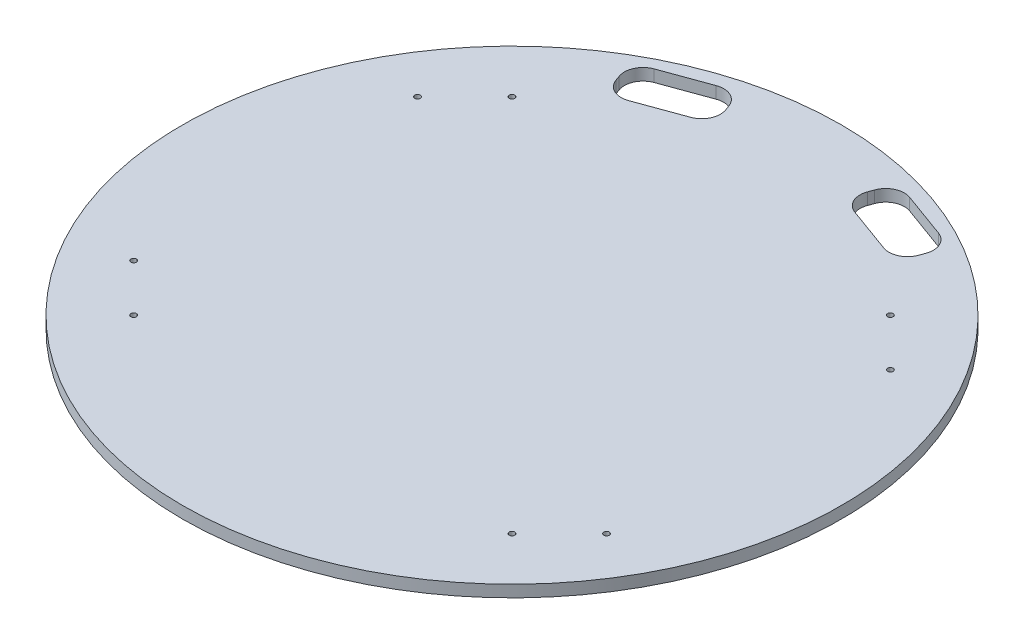
ISO-10303-21;
HEADER;
FILE_DESCRIPTION(('STEP AP214'),'2;1');
FILE_NAME('part.step','',(''),(''),'','','');
FILE_SCHEMA(('AUTOMOTIVE_DESIGN { 1 0 10303 214 1 1 1 1 }'));
ENDSEC;
DATA;
#1=APPLICATION_CONTEXT('core data for automotive mechanical design processes');
#2=APPLICATION_PROTOCOL_DEFINITION('international standard','automotive_design',2000,#1);
#3=PRODUCT_CONTEXT('',#1,'mechanical');
#4=PRODUCT('Part','Part','',(#3));
#5=PRODUCT_RELATED_PRODUCT_CATEGORY('part','',(#4));
#6=PRODUCT_DEFINITION_FORMATION('','',#4);
#7=PRODUCT_DEFINITION_CONTEXT('part definition',#1,'design');
#8=PRODUCT_DEFINITION('design','',#6,#7);
#9=PRODUCT_DEFINITION_SHAPE('','',#8);
#10=(LENGTH_UNIT() NAMED_UNIT(*) SI_UNIT(.MILLI.,.METRE.));
#11=(NAMED_UNIT(*) PLANE_ANGLE_UNIT() SI_UNIT($,.RADIAN.));
#12=(NAMED_UNIT(*) SI_UNIT($,.STERADIAN.) SOLID_ANGLE_UNIT());
#13=UNCERTAINTY_MEASURE_WITH_UNIT(LENGTH_MEASURE(1.E-05),#10,'distance_accuracy_value','');
#14=(GEOMETRIC_REPRESENTATION_CONTEXT(3) GLOBAL_UNCERTAINTY_ASSIGNED_CONTEXT((#13)) GLOBAL_UNIT_ASSIGNED_CONTEXT((#10,
#11,#12)) REPRESENTATION_CONTEXT('',''));
#15=CARTESIAN_POINT('',(0.,0.,0.));
#16=DIRECTION('',(0.,0.,1.));
#17=DIRECTION('',(1.,0.,0.));
#18=AXIS2_PLACEMENT_3D('',#15,#16,#17);
#19=CARTESIAN_POINT('',(0.,6.35,0.));
#20=DIRECTION('',(0.,1.,0.));
#21=DIRECTION('',(0.,0.,1.));
#22=AXIS2_PLACEMENT_3D('',#19,#20,#21);
#23=PLANE('',#22);
#24=CARTESIAN_POINT('',(127.,6.35,76.2));
#25=DIRECTION('',(0.,1.,0.));
#26=DIRECTION('',(0.,0.,1.));
#27=AXIS2_PLACEMENT_3D('',#24,#25,#26);
#28=CIRCLE('',#27,1.5);
#29=CARTESIAN_POINT('',(127.,6.35,77.7));
#30=VERTEX_POINT('',#29);
#31=EDGE_CURVE('E282',#30,#30,#28,.T.);
#32=ORIENTED_EDGE('',*,*,#31,.F.);
#33=EDGE_LOOP('',(#32));
#34=FACE_BOUND('',#33,.T.);
#35=CARTESIAN_POINT('',(-127.,6.35,-76.2));
#36=DIRECTION('',(0.,1.,0.));
#37=DIRECTION('',(0.,0.,1.));
#38=AXIS2_PLACEMENT_3D('',#35,#36,#37);
#39=CIRCLE('',#38,1.5);
#40=CARTESIAN_POINT('',(-127.,6.35,-74.7));
#41=VERTEX_POINT('',#40);
#42=EDGE_CURVE('E294',#41,#41,#39,.T.);
#43=ORIENTED_EDGE('',*,*,#42,.F.);
#44=EDGE_LOOP('',(#43));
#45=FACE_BOUND('',#44,.T.);
#46=CARTESIAN_POINT('',(101.6,6.35,-101.6));
#47=DIRECTION('',(0.,1.,0.));
#48=DIRECTION('',(0.,0.,1.));
#49=AXIS2_PLACEMENT_3D('',#46,#47,#48);
#50=CIRCLE('',#49,1.5);
#51=CARTESIAN_POINT('',(101.6,6.35,-100.1));
#52=VERTEX_POINT('',#51);
#53=EDGE_CURVE('E306',#52,#52,#50,.T.);
#54=ORIENTED_EDGE('',*,*,#53,.F.);
#55=EDGE_LOOP('',(#54));
#56=FACE_BOUND('',#55,.T.);
#57=CARTESIAN_POINT('',(-101.6,6.35,101.6));
#58=DIRECTION('',(0.,1.,0.));
#59=DIRECTION('',(0.,0.,1.));
#60=AXIS2_PLACEMENT_3D('',#57,#58,#59);
#61=CIRCLE('',#60,1.5);
#62=CARTESIAN_POINT('',(-101.6,6.35,103.1));
#63=VERTEX_POINT('',#62);
#64=EDGE_CURVE('E318',#63,#63,#61,.T.);
#65=ORIENTED_EDGE('',*,*,#64,.F.);
#66=EDGE_LOOP('',(#65));
#67=FACE_BOUND('',#66,.T.);
#68=CARTESIAN_POINT('',(0.,6.35,0.));
#69=DIRECTION('',(0.,1.,0.));
#70=DIRECTION('',(0.,0.,1.));
#71=AXIS2_PLACEMENT_3D('',#68,#69,#70);
#72=CIRCLE('',#71,177.);
#73=CARTESIAN_POINT('',(0.,6.35,177.));
#74=VERTEX_POINT('',#73);
#75=EDGE_CURVE('E11',#74,#74,#72,.T.);
#76=ORIENTED_EDGE('',*,*,#75,.T.);
#77=EDGE_LOOP('',(#76));
#78=FACE_BOUND('',#77,.T.);
#79=CARTESIAN_POINT('',(-101.6,6.35,-101.6));
#80=DIRECTION('',(0.,1.,0.));
#81=DIRECTION('',(0.,0.,1.));
#82=AXIS2_PLACEMENT_3D('',#79,#80,#81);
#83=CIRCLE('',#82,1.5);
#84=CARTESIAN_POINT('',(-101.6,6.35,-100.1));
#85=VERTEX_POINT('',#84);
#86=EDGE_CURVE('E312',#85,#85,#83,.T.);
#87=ORIENTED_EDGE('',*,*,#86,.F.);
#88=EDGE_LOOP('',(#87));
#89=FACE_BOUND('',#88,.T.);
#90=CARTESIAN_POINT('',(101.6,6.35,101.6));
#91=DIRECTION('',(0.,1.,0.));
#92=DIRECTION('',(0.,0.,1.));
#93=AXIS2_PLACEMENT_3D('',#90,#91,#92);
#94=CIRCLE('',#93,1.5);
#95=CARTESIAN_POINT('',(101.6,6.35,103.1));
#96=VERTEX_POINT('',#95);
#97=EDGE_CURVE('E300',#96,#96,#94,.T.);
#98=ORIENTED_EDGE('',*,*,#97,.F.);
#99=EDGE_LOOP('',(#98));
#100=FACE_BOUND('',#99,.T.);
#101=CARTESIAN_POINT('',(127.,6.35,-76.2));
#102=DIRECTION('',(0.,1.,0.));
#103=DIRECTION('',(0.,0.,1.));
#104=AXIS2_PLACEMENT_3D('',#101,#102,#103);
#105=CIRCLE('',#104,1.5);
#106=CARTESIAN_POINT('',(127.,6.35,-74.7));
#107=VERTEX_POINT('',#106);
#108=EDGE_CURVE('E288',#107,#107,#105,.T.);
#109=ORIENTED_EDGE('',*,*,#108,.F.);
#110=EDGE_LOOP('',(#109));
#111=FACE_BOUND('',#110,.T.);
#112=CARTESIAN_POINT('',(-127.,6.35,76.2));
#113=DIRECTION('',(0.,1.,0.));
#114=DIRECTION('',(0.,0.,1.));
#115=AXIS2_PLACEMENT_3D('',#112,#113,#114);
#116=CIRCLE('',#115,1.5);
#117=CARTESIAN_POINT('',(-127.,6.35,77.7));
#118=VERTEX_POINT('',#117);
#119=EDGE_CURVE('E276',#118,#118,#116,.T.);
#120=ORIENTED_EDGE('',*,*,#119,.F.);
#121=EDGE_LOOP('',(#120));
#122=FACE_BOUND('',#121,.T.);
#123=DIRECTION('',(0.939692620785913,0.,-0.342020143325657));
#124=VECTOR('',#123,1.);
#125=CARTESIAN_POINT('',(-68.5087329150363,6.35,-131.113736294219));
#126=LINE('',#125,#124);
#127=CARTESIAN_POINT('',(-68.5087329150363,6.35,-131.113736294219));
#128=VERTEX_POINT('',#127);
#129=CARTESIAN_POINT('',(-44.0767247746026,6.35,-140.006260020686));
#130=VERTEX_POINT('',#129);
#131=EDGE_CURVE('E219',#128,#130,#126,.T.);
#132=ORIENTED_EDGE('',*,*,#131,.F.);
#133=CARTESIAN_POINT('',(-71.9289343482928,6.35,-140.510662502078));
#134=DIRECTION('',(0.,1.,0.));
#135=DIRECTION('',(0.,0.,1.));
#136=AXIS2_PLACEMENT_3D('',#133,#134,#135);
#137=CIRCLE('',#136,9.99999999999999);
#138=CARTESIAN_POINT('',(-81.3258605561519,6.35,-137.090461068821));
#139=VERTEX_POINT('',#138);
#140=EDGE_CURVE('E217',#139,#128,#137,.T.);
#141=ORIENTED_EDGE('',*,*,#140,.F.);
#142=DIRECTION('',(0.342020143325679,0.,0.939692620785905));
#143=VECTOR('',#142,1.);
#144=CARTESIAN_POINT('',(-82.351920986129,6.35,-139.909538931179));
#145=LINE('',#144,#143);
#146=CARTESIAN_POINT('',(-82.351920986129,6.35,-139.909538931179));
#147=VERTEX_POINT('',#146);
#148=EDGE_CURVE('E233',#147,#139,#145,.T.);
#149=ORIENTED_EDGE('',*,*,#148,.F.);
#150=CARTESIAN_POINT('',(-72.9549947782699,6.35,-143.329740364436));
#151=DIRECTION('',(0.,1.,0.));
#152=DIRECTION('',(0.,0.,1.));
#153=AXIS2_PLACEMENT_3D('',#150,#151,#152);
#154=CIRCLE('',#153,10.);
#155=CARTESIAN_POINT('',(-76.3751962115266,6.35,-152.726666572295));
#156=VERTEX_POINT('',#155);
#157=EDGE_CURVE('E230',#156,#147,#154,.T.);
#158=ORIENTED_EDGE('',*,*,#157,.F.);
#159=DIRECTION('',(-0.93969262078591,0.,0.342020143325665));
#160=VECTOR('',#159,1.);
#161=CARTESIAN_POINT('',(-76.3751962115266,6.35,-152.726666572295));
#162=LINE('',#161,#160);
#163=CARTESIAN_POINT('',(-51.9431880710929,6.35,-161.619190298762));
#164=VERTEX_POINT('',#163);
#165=EDGE_CURVE('E228',#164,#156,#162,.T.);
#166=ORIENTED_EDGE('',*,*,#165,.F.);
#167=CARTESIAN_POINT('',(-48.5229866378363,6.35,-152.222264090903));
#168=DIRECTION('',(0.,1.,0.));
#169=DIRECTION('',(0.,0.,-1.));
#170=AXIS2_PLACEMENT_3D('',#167,#168,#169);
#171=CIRCLE('',#170,9.99999999999998);
#172=CARTESIAN_POINT('',(-39.1260604299772,6.35,-155.64246552416));
#173=VERTEX_POINT('',#172);
#174=EDGE_CURVE('E226',#173,#164,#171,.T.);
#175=ORIENTED_EDGE('',*,*,#174,.F.);
#176=DIRECTION('',(-0.342020143325668,0.,-0.939692620785908));
#177=VECTOR('',#176,1.);
#178=CARTESIAN_POINT('',(-39.1260604299772,6.35,-155.64246552416));
#179=LINE('',#178,#177);
#180=CARTESIAN_POINT('',(-38.1,6.35,-152.823387661802));
#181=VERTEX_POINT('',#180);
#182=EDGE_CURVE('E224',#181,#173,#179,.T.);
#183=ORIENTED_EDGE('',*,*,#182,.F.);
#184=CARTESIAN_POINT('',(-47.4969262078591,6.35,-149.403186228545));
#185=DIRECTION('',(0.,1.,0.));
#186=DIRECTION('',(0.,0.,1.));
#187=AXIS2_PLACEMENT_3D('',#184,#185,#186);
#188=CIRCLE('',#187,9.99999999999999);
#189=EDGE_CURVE('E222',#130,#181,#188,.T.);
#190=ORIENTED_EDGE('',*,*,#189,.F.);
#191=EDGE_LOOP('',(#132,#141,#149,#158,#166,#175,#183,#190));
#192=FACE_BOUND('',#191,.T.);
#193=DIRECTION('',(0.93969262078591,0.,0.342020143325663));
#194=VECTOR('',#193,1.);
#195=CARTESIAN_POINT('',(44.0767247746025,6.35,-140.006260020686));
#196=LINE('',#195,#194);
#197=CARTESIAN_POINT('',(44.0767247746025,6.35,-140.006260020686));
#198=VERTEX_POINT('',#197);
#199=CARTESIAN_POINT('',(68.5087329150361,6.35,-131.113736294219));
#200=VERTEX_POINT('',#199);
#201=EDGE_CURVE('E160',#198,#200,#196,.T.);
#202=ORIENTED_EDGE('',*,*,#201,.F.);
#203=CARTESIAN_POINT('',(47.4969262078591,6.35,-149.403186228545));
#204=DIRECTION('',(0.,1.,0.));
#205=DIRECTION('',(0.,0.,1.));
#206=AXIS2_PLACEMENT_3D('',#203,#204,#205);
#207=CIRCLE('',#206,9.99999999999999);
#208=CARTESIAN_POINT('',(38.1,6.35,-152.823387661802));
#209=VERTEX_POINT('',#208);
#210=EDGE_CURVE('E152',#209,#198,#207,.T.);
#211=ORIENTED_EDGE('',*,*,#210,.F.);
#212=DIRECTION('',(-0.342020143325667,0.,0.939692620785909));
#213=VECTOR('',#212,1.);
#214=CARTESIAN_POINT('',(39.1260604299771,6.35,-155.64246552416));
#215=LINE('',#214,#213);
#216=CARTESIAN_POINT('',(39.1260604299771,6.35,-155.64246552416));
#217=VERTEX_POINT('',#216);
#218=EDGE_CURVE('E185',#217,#209,#215,.T.);
#219=ORIENTED_EDGE('',*,*,#218,.F.);
#220=CARTESIAN_POINT('',(48.5229866378362,6.35,-152.222264090903));
#221=DIRECTION('',(0.,1.,0.));
#222=DIRECTION('',(0.,0.,1.));
#223=AXIS2_PLACEMENT_3D('',#220,#221,#222);
#224=CIRCLE('',#223,10.);
#225=CARTESIAN_POINT('',(51.943188071093,6.35,-161.619190298762));
#226=VERTEX_POINT('',#225);
#227=EDGE_CURVE('E183',#226,#217,#224,.T.);
#228=ORIENTED_EDGE('',*,*,#227,.F.);
#229=DIRECTION('',(-0.939692620785908,0.,-0.342020143325671));
#230=VECTOR('',#229,1.);
#231=CARTESIAN_POINT('',(51.9431880710929,6.35,-161.619190298762));
#232=LINE('',#231,#230);
#233=CARTESIAN_POINT('',(76.3751962115265,6.35,-152.726666572295));
#234=VERTEX_POINT('',#233);
#235=EDGE_CURVE('E181',#234,#226,#232,.T.);
#236=ORIENTED_EDGE('',*,*,#235,.F.);
#237=CARTESIAN_POINT('',(72.9549947782698,6.35,-143.329740364436));
#238=DIRECTION('',(0.,1.,0.));
#239=DIRECTION('',(0.,0.,-1.));
#240=AXIS2_PLACEMENT_3D('',#237,#238,#239);
#241=CIRCLE('',#240,9.99999999999996);
#242=CARTESIAN_POINT('',(82.3519209861289,6.35,-139.909538931179));
#243=VERTEX_POINT('',#242);
#244=EDGE_CURVE('E179',#243,#234,#241,.T.);
#245=ORIENTED_EDGE('',*,*,#244,.F.);
#246=DIRECTION('',(0.342020143325672,0.,-0.939692620785907));
#247=VECTOR('',#246,1.);
#248=CARTESIAN_POINT('',(82.3519209861289,6.35,-139.909538931179));
#249=LINE('',#248,#247);
#250=CARTESIAN_POINT('',(81.3258605561519,6.35,-137.090461068821));
#251=VERTEX_POINT('',#250);
#252=EDGE_CURVE('E175',#251,#243,#249,.T.);
#253=ORIENTED_EDGE('',*,*,#252,.F.);
#254=CARTESIAN_POINT('',(71.9289343482928,6.35,-140.510662502078));
#255=DIRECTION('',(0.,1.,0.));
#256=DIRECTION('',(0.,0.,1.));
#257=AXIS2_PLACEMENT_3D('',#254,#255,#256);
#258=CIRCLE('',#257,10.);
#259=EDGE_CURVE('E173',#200,#251,#258,.T.);
#260=ORIENTED_EDGE('',*,*,#259,.F.);
#261=EDGE_LOOP('',(#202,#211,#219,#228,#236,#245,#253,#260));
#262=FACE_BOUND('',#261,.T.);
#263=ADVANCED_FACE('F39',(#34,#45,#56,#67,#78,#89,#100,#111,#122,#192,#262),#23,.T.);
#264=CARTESIAN_POINT('',(0.,0.,0.));
#265=DIRECTION('',(0.,1.,0.));
#266=DIRECTION('',(0.,0.,1.));
#267=AXIS2_PLACEMENT_3D('',#264,#265,#266);
#268=PLANE('',#267);
#269=CARTESIAN_POINT('',(-71.9289343482928,0.,-140.510662502078));
#270=DIRECTION('',(0.,1.,0.));
#271=DIRECTION('',(0.,0.,1.));
#272=AXIS2_PLACEMENT_3D('',#269,#270,#271);
#273=CIRCLE('',#272,9.99999999999999);
#274=CARTESIAN_POINT('',(-81.3258605561519,0.,-137.090461068822));
#275=VERTEX_POINT('',#274);
#276=CARTESIAN_POINT('',(-68.5087329150363,0.,-131.113736294219));
#277=VERTEX_POINT('',#276);
#278=EDGE_CURVE('E168',#275,#277,#273,.T.);
#279=ORIENTED_EDGE('',*,*,#278,.T.);
#280=DIRECTION('',(0.939692620785913,0.,-0.342020143325657));
#281=VECTOR('',#280,1.);
#282=CARTESIAN_POINT('',(-68.5087329150363,0.,-131.113736294219));
#283=LINE('',#282,#281);
#284=CARTESIAN_POINT('',(-44.0767247746026,0.,-140.006260020686));
#285=VERTEX_POINT('',#284);
#286=EDGE_CURVE('E238',#277,#285,#283,.T.);
#287=ORIENTED_EDGE('',*,*,#286,.T.);
#288=CARTESIAN_POINT('',(-47.4969262078591,0.,-149.403186228545));
#289=DIRECTION('',(0.,1.,0.));
#290=DIRECTION('',(0.,0.,1.));
#291=AXIS2_PLACEMENT_3D('',#288,#289,#290);
#292=CIRCLE('',#291,9.99999999999999);
#293=CARTESIAN_POINT('',(-38.1,0.,-152.823387661802));
#294=VERTEX_POINT('',#293);
#295=EDGE_CURVE('E241',#285,#294,#292,.T.);
#296=ORIENTED_EDGE('',*,*,#295,.T.);
#297=DIRECTION('',(-0.342020143325668,0.,-0.939692620785908));
#298=VECTOR('',#297,1.);
#299=CARTESIAN_POINT('',(-39.1260604299772,0.,-155.64246552416));
#300=LINE('',#299,#298);
#301=CARTESIAN_POINT('',(-39.1260604299772,0.,-155.64246552416));
#302=VERTEX_POINT('',#301);
#303=EDGE_CURVE('E244',#294,#302,#300,.T.);
#304=ORIENTED_EDGE('',*,*,#303,.T.);
#305=CARTESIAN_POINT('',(-48.5229866378363,0.,-152.222264090903));
#306=DIRECTION('',(0.,1.,0.));
#307=DIRECTION('',(0.,0.,-1.));
#308=AXIS2_PLACEMENT_3D('',#305,#306,#307);
#309=CIRCLE('',#308,9.99999999999998);
#310=CARTESIAN_POINT('',(-51.9431880710929,0.,-161.619190298762));
#311=VERTEX_POINT('',#310);
#312=EDGE_CURVE('E247',#302,#311,#309,.T.);
#313=ORIENTED_EDGE('',*,*,#312,.T.);
#314=DIRECTION('',(-0.93969262078591,0.,0.342020143325665));
#315=VECTOR('',#314,1.);
#316=CARTESIAN_POINT('',(-76.3751962115266,0.,-152.726666572295));
#317=LINE('',#316,#315);
#318=CARTESIAN_POINT('',(-76.3751962115266,0.,-152.726666572295));
#319=VERTEX_POINT('',#318);
#320=EDGE_CURVE('E250',#311,#319,#317,.T.);
#321=ORIENTED_EDGE('',*,*,#320,.T.);
#322=CARTESIAN_POINT('',(-72.9549947782699,0.,-143.329740364436));
#323=DIRECTION('',(0.,1.,0.));
#324=DIRECTION('',(0.,0.,1.));
#325=AXIS2_PLACEMENT_3D('',#322,#323,#324);
#326=CIRCLE('',#325,10.);
#327=CARTESIAN_POINT('',(-82.351920986129,0.,-139.909538931179));
#328=VERTEX_POINT('',#327);
#329=EDGE_CURVE('E253',#319,#328,#326,.T.);
#330=ORIENTED_EDGE('',*,*,#329,.T.);
#331=DIRECTION('',(0.342020143325679,0.,0.939692620785905));
#332=VECTOR('',#331,1.);
#333=CARTESIAN_POINT('',(-82.351920986129,0.,-139.909538931179));
#334=LINE('',#333,#332);
#335=EDGE_CURVE('E220',#328,#275,#334,.T.);
#336=ORIENTED_EDGE('',*,*,#335,.T.);
#337=EDGE_LOOP('',(#279,#287,#296,#304,#313,#321,#330,#336));
#338=FACE_BOUND('',#337,.T.);
#339=CARTESIAN_POINT('',(0.,0.,0.));
#340=DIRECTION('',(0.,1.,0.));
#341=DIRECTION('',(0.,0.,1.));
#342=AXIS2_PLACEMENT_3D('',#339,#340,#341);
#343=CIRCLE('',#342,177.);
#344=CARTESIAN_POINT('',(0.,0.,177.));
#345=VERTEX_POINT('',#344);
#346=EDGE_CURVE('E43',#345,#345,#343,.T.);
#347=ORIENTED_EDGE('',*,*,#346,.F.);
#348=EDGE_LOOP('',(#347));
#349=FACE_BOUND('',#348,.T.);
#350=CARTESIAN_POINT('',(-101.6,0.,101.6));
#351=DIRECTION('',(0.,1.,0.));
#352=DIRECTION('',(0.,0.,1.));
#353=AXIS2_PLACEMENT_3D('',#350,#351,#352);
#354=CIRCLE('',#353,1.5);
#355=CARTESIAN_POINT('',(-101.6,0.,103.1));
#356=VERTEX_POINT('',#355);
#357=EDGE_CURVE('E315',#356,#356,#354,.T.);
#358=ORIENTED_EDGE('',*,*,#357,.T.);
#359=EDGE_LOOP('',(#358));
#360=FACE_BOUND('',#359,.T.);
#361=CARTESIAN_POINT('',(-101.6,0.,-101.6));
#362=DIRECTION('',(0.,1.,0.));
#363=DIRECTION('',(0.,0.,1.));
#364=AXIS2_PLACEMENT_3D('',#361,#362,#363);
#365=CIRCLE('',#364,1.5);
#366=CARTESIAN_POINT('',(-101.6,0.,-100.1));
#367=VERTEX_POINT('',#366);
#368=EDGE_CURVE('E309',#367,#367,#365,.T.);
#369=ORIENTED_EDGE('',*,*,#368,.T.);
#370=EDGE_LOOP('',(#369));
#371=FACE_BOUND('',#370,.T.);
#372=CARTESIAN_POINT('',(101.6,0.,-101.6));
#373=DIRECTION('',(0.,1.,0.));
#374=DIRECTION('',(0.,0.,1.));
#375=AXIS2_PLACEMENT_3D('',#372,#373,#374);
#376=CIRCLE('',#375,1.5);
#377=CARTESIAN_POINT('',(101.6,0.,-100.1));
#378=VERTEX_POINT('',#377);
#379=EDGE_CURVE('E303',#378,#378,#376,.T.);
#380=ORIENTED_EDGE('',*,*,#379,.T.);
#381=EDGE_LOOP('',(#380));
#382=FACE_BOUND('',#381,.T.);
#383=CARTESIAN_POINT('',(101.6,0.,101.6));
#384=DIRECTION('',(0.,1.,0.));
#385=DIRECTION('',(0.,0.,1.));
#386=AXIS2_PLACEMENT_3D('',#383,#384,#385);
#387=CIRCLE('',#386,1.5);
#388=CARTESIAN_POINT('',(101.6,0.,103.1));
#389=VERTEX_POINT('',#388);
#390=EDGE_CURVE('E297',#389,#389,#387,.T.);
#391=ORIENTED_EDGE('',*,*,#390,.T.);
#392=EDGE_LOOP('',(#391));
#393=FACE_BOUND('',#392,.T.);
#394=CARTESIAN_POINT('',(-127.,0.,-76.2));
#395=DIRECTION('',(0.,1.,0.));
#396=DIRECTION('',(0.,0.,1.));
#397=AXIS2_PLACEMENT_3D('',#394,#395,#396);
#398=CIRCLE('',#397,1.5);
#399=CARTESIAN_POINT('',(-127.,0.,-74.7));
#400=VERTEX_POINT('',#399);
#401=EDGE_CURVE('E291',#400,#400,#398,.T.);
#402=ORIENTED_EDGE('',*,*,#401,.T.);
#403=EDGE_LOOP('',(#402));
#404=FACE_BOUND('',#403,.T.);
#405=CARTESIAN_POINT('',(127.,0.,-76.2));
#406=DIRECTION('',(0.,1.,0.));
#407=DIRECTION('',(0.,0.,1.));
#408=AXIS2_PLACEMENT_3D('',#405,#406,#407);
#409=CIRCLE('',#408,1.5);
#410=CARTESIAN_POINT('',(127.,0.,-74.7));
#411=VERTEX_POINT('',#410);
#412=EDGE_CURVE('E285',#411,#411,#409,.T.);
#413=ORIENTED_EDGE('',*,*,#412,.T.);
#414=EDGE_LOOP('',(#413));
#415=FACE_BOUND('',#414,.T.);
#416=CARTESIAN_POINT('',(127.,0.,76.2));
#417=DIRECTION('',(0.,1.,0.));
#418=DIRECTION('',(0.,0.,1.));
#419=AXIS2_PLACEMENT_3D('',#416,#417,#418);
#420=CIRCLE('',#419,1.5);
#421=CARTESIAN_POINT('',(127.,0.,77.7));
#422=VERTEX_POINT('',#421);
#423=EDGE_CURVE('E279',#422,#422,#420,.T.);
#424=ORIENTED_EDGE('',*,*,#423,.T.);
#425=EDGE_LOOP('',(#424));
#426=FACE_BOUND('',#425,.T.);
#427=CARTESIAN_POINT('',(-127.,0.,76.2));
#428=DIRECTION('',(0.,1.,0.));
#429=DIRECTION('',(0.,0.,1.));
#430=AXIS2_PLACEMENT_3D('',#427,#428,#429);
#431=CIRCLE('',#430,1.5);
#432=CARTESIAN_POINT('',(-127.,0.,77.7));
#433=VERTEX_POINT('',#432);
#434=EDGE_CURVE('E275',#433,#433,#431,.T.);
#435=ORIENTED_EDGE('',*,*,#434,.T.);
#436=EDGE_LOOP('',(#435));
#437=FACE_BOUND('',#436,.T.);
#438=CARTESIAN_POINT('',(47.4969262078591,0.,-149.403186228545));
#439=DIRECTION('',(0.,1.,0.));
#440=DIRECTION('',(0.,0.,1.));
#441=AXIS2_PLACEMENT_3D('',#438,#439,#440);
#442=CIRCLE('',#441,9.99999999999999);
#443=CARTESIAN_POINT('',(38.1,0.,-152.823387661802));
#444=VERTEX_POINT('',#443);
#445=CARTESIAN_POINT('',(44.0767247746025,0.,-140.006260020686));
#446=VERTEX_POINT('',#445);
#447=EDGE_CURVE('E62',#444,#446,#442,.T.);
#448=ORIENTED_EDGE('',*,*,#447,.T.);
#449=DIRECTION('',(0.93969262078591,0.,0.342020143325663));
#450=VECTOR('',#449,1.);
#451=CARTESIAN_POINT('',(44.0767247746025,0.,-140.006260020686));
#452=LINE('',#451,#450);
#453=CARTESIAN_POINT('',(68.5087329150361,0.,-131.113736294219));
#454=VERTEX_POINT('',#453);
#455=EDGE_CURVE('E167',#446,#454,#452,.T.);
#456=ORIENTED_EDGE('',*,*,#455,.T.);
#457=CARTESIAN_POINT('',(71.9289343482928,0.,-140.510662502078));
#458=DIRECTION('',(0.,1.,0.));
#459=DIRECTION('',(0.,0.,1.));
#460=AXIS2_PLACEMENT_3D('',#457,#458,#459);
#461=CIRCLE('',#460,10.);
#462=CARTESIAN_POINT('',(81.3258605561519,0.,-137.090461068821));
#463=VERTEX_POINT('',#462);
#464=EDGE_CURVE('E189',#454,#463,#461,.T.);
#465=ORIENTED_EDGE('',*,*,#464,.T.);
#466=DIRECTION('',(0.342020143325672,0.,-0.939692620785907));
#467=VECTOR('',#466,1.);
#468=CARTESIAN_POINT('',(82.3519209861289,0.,-139.909538931179));
#469=LINE('',#468,#467);
#470=CARTESIAN_POINT('',(82.3519209861289,0.,-139.909538931179));
#471=VERTEX_POINT('',#470);
#472=EDGE_CURVE('E192',#463,#471,#469,.T.);
#473=ORIENTED_EDGE('',*,*,#472,.T.);
#474=CARTESIAN_POINT('',(72.9549947782698,0.,-143.329740364436));
#475=DIRECTION('',(0.,1.,0.));
#476=DIRECTION('',(0.,0.,-1.));
#477=AXIS2_PLACEMENT_3D('',#474,#475,#476);
#478=CIRCLE('',#477,9.99999999999996);
#479=CARTESIAN_POINT('',(76.3751962115265,0.,-152.726666572295));
#480=VERTEX_POINT('',#479);
#481=EDGE_CURVE('E195',#471,#480,#478,.T.);
#482=ORIENTED_EDGE('',*,*,#481,.T.);
#483=DIRECTION('',(-0.939692620785908,0.,-0.342020143325671));
#484=VECTOR('',#483,1.);
#485=CARTESIAN_POINT('',(51.9431880710929,0.,-161.619190298762));
#486=LINE('',#485,#484);
#487=CARTESIAN_POINT('',(51.943188071093,0.,-161.619190298762));
#488=VERTEX_POINT('',#487);
#489=EDGE_CURVE('E198',#480,#488,#486,.T.);
#490=ORIENTED_EDGE('',*,*,#489,.T.);
#491=CARTESIAN_POINT('',(48.5229866378362,0.,-152.222264090903));
#492=DIRECTION('',(0.,1.,0.));
#493=DIRECTION('',(0.,0.,1.));
#494=AXIS2_PLACEMENT_3D('',#491,#492,#493);
#495=CIRCLE('',#494,10.);
#496=CARTESIAN_POINT('',(39.1260604299771,0.,-155.64246552416));
#497=VERTEX_POINT('',#496);
#498=EDGE_CURVE('E201',#488,#497,#495,.T.);
#499=ORIENTED_EDGE('',*,*,#498,.T.);
#500=DIRECTION('',(-0.342020143325667,0.,0.939692620785909));
#501=VECTOR('',#500,1.);
#502=CARTESIAN_POINT('',(39.1260604299771,0.,-155.64246552416));
#503=LINE('',#502,#501);
#504=EDGE_CURVE('E161',#497,#444,#503,.T.);
#505=ORIENTED_EDGE('',*,*,#504,.T.);
#506=EDGE_LOOP('',(#448,#456,#465,#473,#482,#490,#499,#505));
#507=FACE_BOUND('',#506,.T.);
#508=ADVANCED_FACE('F324',(#338,#349,#360,#371,#382,#393,#404,#415,#426,#437,#507),#268,.F.);
#509=CARTESIAN_POINT('',(0.,6.35,0.));
#510=DIRECTION('',(0.,-1.,0.));
#511=DIRECTION('',(0.,0.,-1.));
#512=AXIS2_PLACEMENT_3D('',#509,#510,#511);
#513=CYLINDRICAL_SURFACE('',#512,177.);
#514=ORIENTED_EDGE('',*,*,#75,.F.);
#515=EDGE_LOOP('',(#514));
#516=FACE_BOUND('',#515,.T.);
#517=ORIENTED_EDGE('',*,*,#346,.T.);
#518=EDGE_LOOP('',(#517));
#519=FACE_BOUND('',#518,.T.);
#520=ADVANCED_FACE('F41',(#516,#519),#513,.T.);
#521=CARTESIAN_POINT('',(-101.6,6.35,101.6));
#522=DIRECTION('',(0.,-1.,0.));
#523=DIRECTION('',(0.,0.,-1.));
#524=AXIS2_PLACEMENT_3D('',#521,#522,#523);
#525=CYLINDRICAL_SURFACE('',#524,1.5);
#526=ORIENTED_EDGE('',*,*,#64,.T.);
#527=EDGE_LOOP('',(#526));
#528=FACE_BOUND('',#527,.T.);
#529=ORIENTED_EDGE('',*,*,#357,.F.);
#530=EDGE_LOOP('',(#529));
#531=FACE_BOUND('',#530,.T.);
#532=ADVANCED_FACE('F327',(#528,#531),#525,.F.);
#533=CARTESIAN_POINT('',(-101.6,6.35,-101.6));
#534=DIRECTION('',(0.,-1.,0.));
#535=DIRECTION('',(0.,0.,-1.));
#536=AXIS2_PLACEMENT_3D('',#533,#534,#535);
#537=CYLINDRICAL_SURFACE('',#536,1.5);
#538=ORIENTED_EDGE('',*,*,#86,.T.);
#539=EDGE_LOOP('',(#538));
#540=FACE_BOUND('',#539,.T.);
#541=ORIENTED_EDGE('',*,*,#368,.F.);
#542=EDGE_LOOP('',(#541));
#543=FACE_BOUND('',#542,.T.);
#544=ADVANCED_FACE('F329',(#540,#543),#537,.F.);
#545=CARTESIAN_POINT('',(101.6,6.35,-101.6));
#546=DIRECTION('',(0.,-1.,0.));
#547=DIRECTION('',(0.,0.,-1.));
#548=AXIS2_PLACEMENT_3D('',#545,#546,#547);
#549=CYLINDRICAL_SURFACE('',#548,1.5);
#550=ORIENTED_EDGE('',*,*,#53,.T.);
#551=EDGE_LOOP('',(#550));
#552=FACE_BOUND('',#551,.T.);
#553=ORIENTED_EDGE('',*,*,#379,.F.);
#554=EDGE_LOOP('',(#553));
#555=FACE_BOUND('',#554,.T.);
#556=ADVANCED_FACE('F336',(#552,#555),#549,.F.);
#557=CARTESIAN_POINT('',(101.6,6.35,101.6));
#558=DIRECTION('',(0.,-1.,0.));
#559=DIRECTION('',(0.,0.,-1.));
#560=AXIS2_PLACEMENT_3D('',#557,#558,#559);
#561=CYLINDRICAL_SURFACE('',#560,1.5);
#562=ORIENTED_EDGE('',*,*,#97,.T.);
#563=EDGE_LOOP('',(#562));
#564=FACE_BOUND('',#563,.T.);
#565=ORIENTED_EDGE('',*,*,#390,.F.);
#566=EDGE_LOOP('',(#565));
#567=FACE_BOUND('',#566,.T.);
#568=ADVANCED_FACE('F432',(#564,#567),#561,.F.);
#569=CARTESIAN_POINT('',(-127.,6.35,-76.2));
#570=DIRECTION('',(0.,-1.,0.));
#571=DIRECTION('',(0.,0.,-1.));
#572=AXIS2_PLACEMENT_3D('',#569,#570,#571);
#573=CYLINDRICAL_SURFACE('',#572,1.5);
#574=ORIENTED_EDGE('',*,*,#42,.T.);
#575=EDGE_LOOP('',(#574));
#576=FACE_BOUND('',#575,.T.);
#577=ORIENTED_EDGE('',*,*,#401,.F.);
#578=EDGE_LOOP('',(#577));
#579=FACE_BOUND('',#578,.T.);
#580=ADVANCED_FACE('F428',(#576,#579),#573,.F.);
#581=CARTESIAN_POINT('',(127.,6.35,-76.2));
#582=DIRECTION('',(0.,-1.,0.));
#583=DIRECTION('',(0.,0.,-1.));
#584=AXIS2_PLACEMENT_3D('',#581,#582,#583);
#585=CYLINDRICAL_SURFACE('',#584,1.5);
#586=ORIENTED_EDGE('',*,*,#108,.T.);
#587=EDGE_LOOP('',(#586));
#588=FACE_BOUND('',#587,.T.);
#589=ORIENTED_EDGE('',*,*,#412,.F.);
#590=EDGE_LOOP('',(#589));
#591=FACE_BOUND('',#590,.T.);
#592=ADVANCED_FACE('F424',(#588,#591),#585,.F.);
#593=CARTESIAN_POINT('',(127.,6.35,76.2));
#594=DIRECTION('',(0.,-1.,0.));
#595=DIRECTION('',(0.,0.,-1.));
#596=AXIS2_PLACEMENT_3D('',#593,#594,#595);
#597=CYLINDRICAL_SURFACE('',#596,1.5);
#598=ORIENTED_EDGE('',*,*,#31,.T.);
#599=EDGE_LOOP('',(#598));
#600=FACE_BOUND('',#599,.T.);
#601=ORIENTED_EDGE('',*,*,#423,.F.);
#602=EDGE_LOOP('',(#601));
#603=FACE_BOUND('',#602,.T.);
#604=ADVANCED_FACE('F420',(#600,#603),#597,.F.);
#605=CARTESIAN_POINT('',(-127.,6.35,76.2));
#606=DIRECTION('',(0.,-1.,0.));
#607=DIRECTION('',(0.,0.,-1.));
#608=AXIS2_PLACEMENT_3D('',#605,#606,#607);
#609=CYLINDRICAL_SURFACE('',#608,1.5);
#610=ORIENTED_EDGE('',*,*,#119,.T.);
#611=EDGE_LOOP('',(#610));
#612=FACE_BOUND('',#611,.T.);
#613=ORIENTED_EDGE('',*,*,#434,.F.);
#614=EDGE_LOOP('',(#613));
#615=FACE_BOUND('',#614,.T.);
#616=ADVANCED_FACE('F417',(#612,#615),#609,.F.);
#617=CARTESIAN_POINT('',(-71.9289343482928,6.35,-140.510662502078));
#618=DIRECTION('',(0.,-1.,0.));
#619=DIRECTION('',(0.,0.,-1.));
#620=AXIS2_PLACEMENT_3D('',#617,#618,#619);
#621=CYLINDRICAL_SURFACE('',#620,9.99999999999999);
#622=ORIENTED_EDGE('',*,*,#278,.F.);
#623=DIRECTION('',(0.,-1.,0.));
#624=VECTOR('',#623,1.);
#625=CARTESIAN_POINT('',(-81.3258605561519,6.35,-137.090461068821));
#626=LINE('',#625,#624);
#627=EDGE_CURVE('E235',#139,#275,#626,.T.);
#628=ORIENTED_EDGE('',*,*,#627,.F.);
#629=ORIENTED_EDGE('',*,*,#140,.T.);
#630=DIRECTION('',(0.,-1.,0.));
#631=VECTOR('',#630,1.);
#632=CARTESIAN_POINT('',(-68.5087329150363,6.35,-131.113736294219));
#633=LINE('',#632,#631);
#634=EDGE_CURVE('E272',#128,#277,#633,.T.);
#635=ORIENTED_EDGE('',*,*,#634,.T.);
#636=EDGE_LOOP('',(#622,#628,#629,#635));
#637=FACE_BOUND('',#636,.T.);
#638=ADVANCED_FACE('F381',(#637),#621,.F.);
#639=CARTESIAN_POINT('',(-68.5087329150363,6.35,-131.113736294219));
#640=DIRECTION('',(-0.342020143325657,0.,-0.939692620785913));
#641=DIRECTION('',(-0.939692620785913,0.,0.342020143325657));
#642=AXIS2_PLACEMENT_3D('',#639,#640,#641);
#643=PLANE('',#642);
#644=ORIENTED_EDGE('',*,*,#286,.F.);
#645=ORIENTED_EDGE('',*,*,#634,.F.);
#646=ORIENTED_EDGE('',*,*,#131,.T.);
#647=DIRECTION('',(0.,-1.,0.));
#648=VECTOR('',#647,1.);
#649=CARTESIAN_POINT('',(-44.0767247746026,6.35,-140.006260020686));
#650=LINE('',#649,#648);
#651=EDGE_CURVE('E270',#130,#285,#650,.T.);
#652=ORIENTED_EDGE('',*,*,#651,.T.);
#653=EDGE_LOOP('',(#644,#645,#646,#652));
#654=FACE_BOUND('',#653,.T.);
#655=ADVANCED_FACE('F373',(#654),#643,.T.);
#656=CARTESIAN_POINT('',(-47.4969262078591,6.35,-149.403186228545));
#657=DIRECTION('',(0.,-1.,0.));
#658=DIRECTION('',(0.,0.,-1.));
#659=AXIS2_PLACEMENT_3D('',#656,#657,#658);
#660=CYLINDRICAL_SURFACE('',#659,9.99999999999999);
#661=ORIENTED_EDGE('',*,*,#295,.F.);
#662=ORIENTED_EDGE('',*,*,#651,.F.);
#663=ORIENTED_EDGE('',*,*,#189,.T.);
#664=DIRECTION('',(0.,-1.,0.));
#665=VECTOR('',#664,1.);
#666=CARTESIAN_POINT('',(-38.1,6.35,-152.823387661802));
#667=LINE('',#666,#665);
#668=EDGE_CURVE('E268',#181,#294,#667,.T.);
#669=ORIENTED_EDGE('',*,*,#668,.T.);
#670=EDGE_LOOP('',(#661,#662,#663,#669));
#671=FACE_BOUND('',#670,.T.);
#672=ADVANCED_FACE('F376',(#671),#660,.F.);
#673=CARTESIAN_POINT('',(-39.1260604299772,6.35,-155.64246552416));
#674=DIRECTION('',(-0.939692620785908,0.,0.342020143325668));
#675=DIRECTION('',(0.342020143325668,0.,0.939692620785909));
#676=AXIS2_PLACEMENT_3D('',#673,#674,#675);
#677=PLANE('',#676);
#678=ORIENTED_EDGE('',*,*,#303,.F.);
#679=ORIENTED_EDGE('',*,*,#668,.F.);
#680=ORIENTED_EDGE('',*,*,#182,.T.);
#681=DIRECTION('',(0.,-1.,0.));
#682=VECTOR('',#681,1.);
#683=CARTESIAN_POINT('',(-39.1260604299772,6.35,-155.64246552416));
#684=LINE('',#683,#682);
#685=EDGE_CURVE('E266',#173,#302,#684,.T.);
#686=ORIENTED_EDGE('',*,*,#685,.T.);
#687=EDGE_LOOP('',(#678,#679,#680,#686));
#688=FACE_BOUND('',#687,.T.);
#689=ADVANCED_FACE('F402',(#688),#677,.T.);
#690=CARTESIAN_POINT('',(-48.5229866378363,6.35,-152.222264090903));
#691=DIRECTION('',(0.,-1.,0.));
#692=DIRECTION('',(0.,0.,-1.));
#693=AXIS2_PLACEMENT_3D('',#690,#691,#692);
#694=CYLINDRICAL_SURFACE('',#693,9.99999999999998);
#695=ORIENTED_EDGE('',*,*,#312,.F.);
#696=ORIENTED_EDGE('',*,*,#685,.F.);
#697=ORIENTED_EDGE('',*,*,#174,.T.);
#698=DIRECTION('',(0.,-1.,0.));
#699=VECTOR('',#698,1.);
#700=CARTESIAN_POINT('',(-51.9431880710929,6.35,-161.619190298762));
#701=LINE('',#700,#699);
#702=EDGE_CURVE('E264',#164,#311,#701,.T.);
#703=ORIENTED_EDGE('',*,*,#702,.T.);
#704=EDGE_LOOP('',(#695,#696,#697,#703));
#705=FACE_BOUND('',#704,.T.);
#706=ADVANCED_FACE('F399',(#705),#694,.F.);
#707=CARTESIAN_POINT('',(-76.3751962115266,6.35,-152.726666572295));
#708=DIRECTION('',(0.342020143325665,0.,0.93969262078591));
#709=DIRECTION('',(0.93969262078591,0.,-0.342020143325665));
#710=AXIS2_PLACEMENT_3D('',#707,#708,#709);
#711=PLANE('',#710);
#712=ORIENTED_EDGE('',*,*,#320,.F.);
#713=ORIENTED_EDGE('',*,*,#702,.F.);
#714=ORIENTED_EDGE('',*,*,#165,.T.);
#715=DIRECTION('',(0.,-1.,0.));
#716=VECTOR('',#715,1.);
#717=CARTESIAN_POINT('',(-76.3751962115266,6.35,-152.726666572295));
#718=LINE('',#717,#716);
#719=EDGE_CURVE('E262',#156,#319,#718,.T.);
#720=ORIENTED_EDGE('',*,*,#719,.T.);
#721=EDGE_LOOP('',(#712,#713,#714,#720));
#722=FACE_BOUND('',#721,.T.);
#723=ADVANCED_FACE('F396',(#722),#711,.T.);
#724=CARTESIAN_POINT('',(-72.9549947782699,6.35,-143.329740364436));
#725=DIRECTION('',(0.,-1.,0.));
#726=DIRECTION('',(0.,0.,-1.));
#727=AXIS2_PLACEMENT_3D('',#724,#725,#726);
#728=CYLINDRICAL_SURFACE('',#727,10.);
#729=ORIENTED_EDGE('',*,*,#329,.F.);
#730=ORIENTED_EDGE('',*,*,#719,.F.);
#731=ORIENTED_EDGE('',*,*,#157,.T.);
#732=DIRECTION('',(0.,-1.,0.));
#733=VECTOR('',#732,1.);
#734=CARTESIAN_POINT('',(-82.351920986129,6.35,-139.909538931179));
#735=LINE('',#734,#733);
#736=EDGE_CURVE('E260',#147,#328,#735,.T.);
#737=ORIENTED_EDGE('',*,*,#736,.T.);
#738=EDGE_LOOP('',(#729,#730,#731,#737));
#739=FACE_BOUND('',#738,.T.);
#740=ADVANCED_FACE('F390',(#739),#728,.F.);
#741=CARTESIAN_POINT('',(-82.351920986129,6.35,-139.909538931179));
#742=DIRECTION('',(0.939692620785905,0.,-0.342020143325679));
#743=DIRECTION('',(-0.342020143325679,0.,-0.939692620785905));
#744=AXIS2_PLACEMENT_3D('',#741,#742,#743);
#745=PLANE('',#744);
#746=ORIENTED_EDGE('',*,*,#335,.F.);
#747=ORIENTED_EDGE('',*,*,#736,.F.);
#748=ORIENTED_EDGE('',*,*,#148,.T.);
#749=ORIENTED_EDGE('',*,*,#627,.T.);
#750=EDGE_LOOP('',(#746,#747,#748,#749));
#751=FACE_BOUND('',#750,.T.);
#752=ADVANCED_FACE('F385',(#751),#745,.T.);
#753=CARTESIAN_POINT('',(47.4969262078591,6.35,-149.403186228545));
#754=DIRECTION('',(0.,-1.,0.));
#755=DIRECTION('',(0.,0.,-1.));
#756=AXIS2_PLACEMENT_3D('',#753,#754,#755);
#757=CYLINDRICAL_SURFACE('',#756,9.99999999999999);
#758=ORIENTED_EDGE('',*,*,#447,.F.);
#759=DIRECTION('',(0.,-1.,0.));
#760=VECTOR('',#759,1.);
#761=CARTESIAN_POINT('',(38.1,6.35,-152.823387661802));
#762=LINE('',#761,#760);
#763=EDGE_CURVE('E156',#209,#444,#762,.T.);
#764=ORIENTED_EDGE('',*,*,#763,.F.);
#765=ORIENTED_EDGE('',*,*,#210,.T.);
#766=DIRECTION('',(0.,-1.,0.));
#767=VECTOR('',#766,1.);
#768=CARTESIAN_POINT('',(44.0767247746025,6.35,-140.006260020686));
#769=LINE('',#768,#767);
#770=EDGE_CURVE('E155',#198,#446,#769,.T.);
#771=ORIENTED_EDGE('',*,*,#770,.T.);
#772=EDGE_LOOP('',(#758,#764,#765,#771));
#773=FACE_BOUND('',#772,.T.);
#774=ADVANCED_FACE('F154',(#773),#757,.F.);
#775=CARTESIAN_POINT('',(44.0767247746025,6.35,-140.006260020686));
#776=DIRECTION('',(0.342020143325663,0.,-0.93969262078591));
#777=DIRECTION('',(-0.939692620785911,0.,-0.342020143325663));
#778=AXIS2_PLACEMENT_3D('',#775,#776,#777);
#779=PLANE('',#778);
#780=ORIENTED_EDGE('',*,*,#455,.F.);
#781=ORIENTED_EDGE('',*,*,#770,.F.);
#782=ORIENTED_EDGE('',*,*,#201,.T.);
#783=DIRECTION('',(0.,-1.,0.));
#784=VECTOR('',#783,1.);
#785=CARTESIAN_POINT('',(68.5087329150361,6.35,-131.113736294219));
#786=LINE('',#785,#784);
#787=EDGE_CURVE('E169',#200,#454,#786,.T.);
#788=ORIENTED_EDGE('',*,*,#787,.T.);
#789=EDGE_LOOP('',(#780,#781,#782,#788));
#790=FACE_BOUND('',#789,.T.);
#791=ADVANCED_FACE('F164',(#790),#779,.T.);
#792=CARTESIAN_POINT('',(71.9289343482928,6.35,-140.510662502078));
#793=DIRECTION('',(0.,-1.,0.));
#794=DIRECTION('',(0.,0.,-1.));
#795=AXIS2_PLACEMENT_3D('',#792,#793,#794);
#796=CYLINDRICAL_SURFACE('',#795,10.);
#797=ORIENTED_EDGE('',*,*,#464,.F.);
#798=ORIENTED_EDGE('',*,*,#787,.F.);
#799=ORIENTED_EDGE('',*,*,#259,.T.);
#800=DIRECTION('',(0.,-1.,0.));
#801=VECTOR('',#800,1.);
#802=CARTESIAN_POINT('',(81.3258605561519,6.35,-137.090461068821));
#803=LINE('',#802,#801);
#804=EDGE_CURVE('E214',#251,#463,#803,.T.);
#805=ORIENTED_EDGE('',*,*,#804,.T.);
#806=EDGE_LOOP('',(#797,#798,#799,#805));
#807=FACE_BOUND('',#806,.T.);
#808=ADVANCED_FACE('F477',(#807),#796,.F.);
#809=CARTESIAN_POINT('',(82.3519209861289,6.35,-139.909538931179));
#810=DIRECTION('',(-0.939692620785907,0.,-0.342020143325672));
#811=DIRECTION('',(-0.342020143325672,0.,0.939692620785907));
#812=AXIS2_PLACEMENT_3D('',#809,#810,#811);
#813=PLANE('',#812);
#814=ORIENTED_EDGE('',*,*,#472,.F.);
#815=ORIENTED_EDGE('',*,*,#804,.F.);
#816=ORIENTED_EDGE('',*,*,#252,.T.);
#817=DIRECTION('',(0.,-1.,0.));
#818=VECTOR('',#817,1.);
#819=CARTESIAN_POINT('',(82.3519209861289,6.35,-139.909538931179));
#820=LINE('',#819,#818);
#821=EDGE_CURVE('E212',#243,#471,#820,.T.);
#822=ORIENTED_EDGE('',*,*,#821,.T.);
#823=EDGE_LOOP('',(#814,#815,#816,#822));
#824=FACE_BOUND('',#823,.T.);
#825=ADVANCED_FACE('F474',(#824),#813,.T.);
#826=CARTESIAN_POINT('',(72.9549947782698,6.35,-143.329740364436));
#827=DIRECTION('',(0.,-1.,0.));
#828=DIRECTION('',(0.,0.,-1.));
#829=AXIS2_PLACEMENT_3D('',#826,#827,#828);
#830=CYLINDRICAL_SURFACE('',#829,9.99999999999996);
#831=ORIENTED_EDGE('',*,*,#481,.F.);
#832=ORIENTED_EDGE('',*,*,#821,.F.);
#833=ORIENTED_EDGE('',*,*,#244,.T.);
#834=DIRECTION('',(0.,-1.,0.));
#835=VECTOR('',#834,1.);
#836=CARTESIAN_POINT('',(76.3751962115265,6.35,-152.726666572295));
#837=LINE('',#836,#835);
#838=EDGE_CURVE('E210',#234,#480,#837,.T.);
#839=ORIENTED_EDGE('',*,*,#838,.T.);
#840=EDGE_LOOP('',(#831,#832,#833,#839));
#841=FACE_BOUND('',#840,.T.);
#842=ADVANCED_FACE('F469',(#841),#830,.F.);
#843=CARTESIAN_POINT('',(51.9431880710929,6.35,-161.619190298762));
#844=DIRECTION('',(-0.342020143325671,0.,0.939692620785908));
#845=DIRECTION('',(0.939692620785908,0.,0.342020143325671));
#846=AXIS2_PLACEMENT_3D('',#843,#844,#845);
#847=PLANE('',#846);
#848=ORIENTED_EDGE('',*,*,#489,.F.);
#849=ORIENTED_EDGE('',*,*,#838,.F.);
#850=ORIENTED_EDGE('',*,*,#235,.T.);
#851=DIRECTION('',(0.,-1.,0.));
#852=VECTOR('',#851,1.);
#853=CARTESIAN_POINT('',(51.943188071093,6.35,-161.619190298762));
#854=LINE('',#853,#852);
#855=EDGE_CURVE('E208',#226,#488,#854,.T.);
#856=ORIENTED_EDGE('',*,*,#855,.T.);
#857=EDGE_LOOP('',(#848,#849,#850,#856));
#858=FACE_BOUND('',#857,.T.);
#859=ADVANCED_FACE('F465',(#858),#847,.T.);
#860=CARTESIAN_POINT('',(48.5229866378362,6.35,-152.222264090903));
#861=DIRECTION('',(0.,-1.,0.));
#862=DIRECTION('',(0.,0.,-1.));
#863=AXIS2_PLACEMENT_3D('',#860,#861,#862);
#864=CYLINDRICAL_SURFACE('',#863,10.);
#865=ORIENTED_EDGE('',*,*,#498,.F.);
#866=ORIENTED_EDGE('',*,*,#855,.F.);
#867=ORIENTED_EDGE('',*,*,#227,.T.);
#868=DIRECTION('',(0.,-1.,0.));
#869=VECTOR('',#868,1.);
#870=CARTESIAN_POINT('',(39.1260604299771,6.35,-155.64246552416));
#871=LINE('',#870,#869);
#872=EDGE_CURVE('E54',#217,#497,#871,.T.);
#873=ORIENTED_EDGE('',*,*,#872,.T.);
#874=EDGE_LOOP('',(#865,#866,#867,#873));
#875=FACE_BOUND('',#874,.T.);
#876=ADVANCED_FACE('F462',(#875),#864,.F.);
#877=CARTESIAN_POINT('',(39.1260604299771,6.35,-155.64246552416));
#878=DIRECTION('',(0.939692620785909,0.,0.342020143325667));
#879=DIRECTION('',(0.342020143325667,0.,-0.939692620785909));
#880=AXIS2_PLACEMENT_3D('',#877,#878,#879);
#881=PLANE('',#880);
#882=ORIENTED_EDGE('',*,*,#504,.F.);
#883=ORIENTED_EDGE('',*,*,#872,.F.);
#884=ORIENTED_EDGE('',*,*,#218,.T.);
#885=ORIENTED_EDGE('',*,*,#763,.T.);
#886=EDGE_LOOP('',(#882,#883,#884,#885));
#887=FACE_BOUND('',#886,.T.);
#888=ADVANCED_FACE('F456',(#887),#881,.T.);
#889=CLOSED_SHELL('',(#263,#508,#520,#532,#544,#556,#568,#580,#592,#604,#616,#638,#655,#672,
#689,#706,#723,#740,#752,#774,#791,#808,#825,#842,#859,#876,#888));
#890=MANIFOLD_SOLID_BREP('B2',#889);
#891=ADVANCED_BREP_SHAPE_REPRESENTATION('',(#18,#890),#14);
#892=SHAPE_DEFINITION_REPRESENTATION(#9,#891);
ENDSEC;
END-ISO-10303-21;
